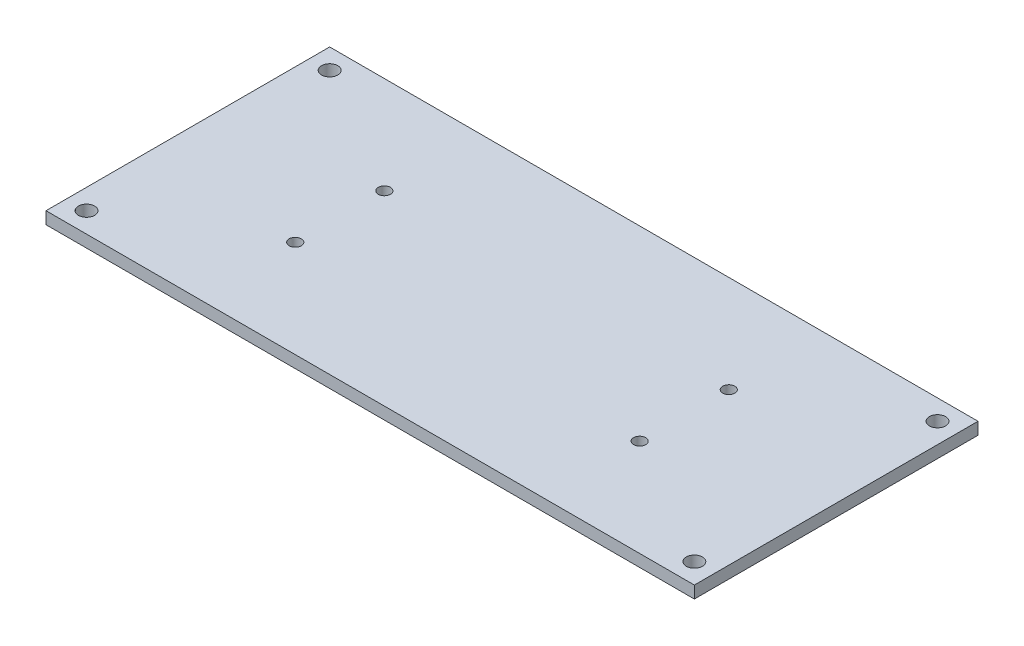
ISO-10303-21;
HEADER;
FILE_DESCRIPTION(('STEP AP214'),'2;1');
FILE_NAME('part.step','',(''),(''),'','','');
FILE_SCHEMA(('AUTOMOTIVE_DESIGN { 1 0 10303 214 1 1 1 1 }'));
ENDSEC;
DATA;
#1=APPLICATION_CONTEXT('core data for automotive mechanical design processes');
#2=APPLICATION_PROTOCOL_DEFINITION('international standard','automotive_design',2000,#1);
#3=PRODUCT_CONTEXT('',#1,'mechanical');
#4=PRODUCT('Part','Part','',(#3));
#5=PRODUCT_RELATED_PRODUCT_CATEGORY('part','',(#4));
#6=PRODUCT_DEFINITION_FORMATION('','',#4);
#7=PRODUCT_DEFINITION_CONTEXT('part definition',#1,'design');
#8=PRODUCT_DEFINITION('design','',#6,#7);
#9=PRODUCT_DEFINITION_SHAPE('','',#8);
#10=(LENGTH_UNIT() NAMED_UNIT(*) SI_UNIT(.MILLI.,.METRE.));
#11=(NAMED_UNIT(*) PLANE_ANGLE_UNIT() SI_UNIT($,.RADIAN.));
#12=(NAMED_UNIT(*) SI_UNIT($,.STERADIAN.) SOLID_ANGLE_UNIT());
#13=UNCERTAINTY_MEASURE_WITH_UNIT(LENGTH_MEASURE(1.E-05),#10,'distance_accuracy_value','');
#14=(GEOMETRIC_REPRESENTATION_CONTEXT(3) GLOBAL_UNCERTAINTY_ASSIGNED_CONTEXT((#13)) GLOBAL_UNIT_ASSIGNED_CONTEXT((#10,
#11,#12)) REPRESENTATION_CONTEXT('',''));
#15=CARTESIAN_POINT('',(0.,0.,0.));
#16=DIRECTION('',(0.,0.,1.));
#17=DIRECTION('',(1.,0.,0.));
#18=AXIS2_PLACEMENT_3D('',#15,#16,#17);
#19=CARTESIAN_POINT('',(80.,3.,-35.));
#20=DIRECTION('',(-1.,0.,0.));
#21=DIRECTION('',(0.,0.,1.));
#22=AXIS2_PLACEMENT_3D('',#19,#20,#21);
#23=PLANE('',#22);
#24=DIRECTION('',(0.,0.,-1.));
#25=VECTOR('',#24,1.);
#26=CARTESIAN_POINT('',(80.,0.,-35.));
#27=LINE('',#26,#25);
#28=CARTESIAN_POINT('',(80.,0.,35.));
#29=VERTEX_POINT('',#28);
#30=CARTESIAN_POINT('',(80.,0.,-35.));
#31=VERTEX_POINT('',#30);
#32=EDGE_CURVE('E101',#29,#31,#27,.T.);
#33=ORIENTED_EDGE('',*,*,#32,.T.);
#34=DIRECTION('',(0.,-1.,0.));
#35=VECTOR('',#34,1.);
#36=CARTESIAN_POINT('',(80.,3.,-35.));
#37=LINE('',#36,#35);
#38=CARTESIAN_POINT('',(80.,3.,-35.));
#39=VERTEX_POINT('',#38);
#40=EDGE_CURVE('E11',#39,#31,#37,.T.);
#41=ORIENTED_EDGE('',*,*,#40,.F.);
#42=DIRECTION('',(0.,0.,-1.));
#43=VECTOR('',#42,1.);
#44=CARTESIAN_POINT('',(80.,3.,-35.));
#45=LINE('',#44,#43);
#46=CARTESIAN_POINT('',(80.,3.,35.));
#47=VERTEX_POINT('',#46);
#48=EDGE_CURVE('E88',#47,#39,#45,.T.);
#49=ORIENTED_EDGE('',*,*,#48,.F.);
#50=DIRECTION('',(0.,-1.,0.));
#51=VECTOR('',#50,1.);
#52=CARTESIAN_POINT('',(80.,3.,35.));
#53=LINE('',#52,#51);
#54=EDGE_CURVE('E97',#47,#29,#53,.T.);
#55=ORIENTED_EDGE('',*,*,#54,.T.);
#56=EDGE_LOOP('',(#33,#41,#49,#55));
#57=FACE_BOUND('',#56,.T.);
#58=ADVANCED_FACE('F35',(#57),#23,.F.);
#59=CARTESIAN_POINT('',(-80.,3.,-35.));
#60=DIRECTION('',(0.,0.,1.));
#61=DIRECTION('',(1.,0.,0.));
#62=AXIS2_PLACEMENT_3D('',#59,#60,#61);
#63=PLANE('',#62);
#64=DIRECTION('',(-1.,0.,0.));
#65=VECTOR('',#64,1.);
#66=CARTESIAN_POINT('',(-80.,0.,-35.));
#67=LINE('',#66,#65);
#68=CARTESIAN_POINT('',(-80.,0.,-35.));
#69=VERTEX_POINT('',#68);
#70=EDGE_CURVE('E92',#31,#69,#67,.T.);
#71=ORIENTED_EDGE('',*,*,#70,.T.);
#72=DIRECTION('',(0.,-1.,0.));
#73=VECTOR('',#72,1.);
#74=CARTESIAN_POINT('',(-80.,3.,-35.));
#75=LINE('',#74,#73);
#76=CARTESIAN_POINT('',(-80.,3.,-35.));
#77=VERTEX_POINT('',#76);
#78=EDGE_CURVE('E44',#77,#69,#75,.T.);
#79=ORIENTED_EDGE('',*,*,#78,.F.);
#80=DIRECTION('',(-1.,0.,0.));
#81=VECTOR('',#80,1.);
#82=CARTESIAN_POINT('',(-80.,3.,-35.));
#83=LINE('',#82,#81);
#84=EDGE_CURVE('E83',#39,#77,#83,.T.);
#85=ORIENTED_EDGE('',*,*,#84,.F.);
#86=ORIENTED_EDGE('',*,*,#40,.T.);
#87=EDGE_LOOP('',(#71,#79,#85,#86));
#88=FACE_BOUND('',#87,.T.);
#89=ADVANCED_FACE('F91',(#88),#63,.F.);
#90=CARTESIAN_POINT('',(-80.,3.,-35.));
#91=DIRECTION('',(1.,0.,0.));
#92=DIRECTION('',(0.,0.,-1.));
#93=AXIS2_PLACEMENT_3D('',#90,#91,#92);
#94=PLANE('',#93);
#95=DIRECTION('',(0.,0.,1.));
#96=VECTOR('',#95,1.);
#97=CARTESIAN_POINT('',(-80.,0.,-35.));
#98=LINE('',#97,#96);
#99=CARTESIAN_POINT('',(-80.,0.,35.));
#100=VERTEX_POINT('',#99);
#101=EDGE_CURVE('E70',#69,#100,#98,.T.);
#102=ORIENTED_EDGE('',*,*,#101,.T.);
#103=DIRECTION('',(0.,-1.,0.));
#104=VECTOR('',#103,1.);
#105=CARTESIAN_POINT('',(-80.,3.,35.));
#106=LINE('',#105,#104);
#107=CARTESIAN_POINT('',(-80.,3.,35.));
#108=VERTEX_POINT('',#107);
#109=EDGE_CURVE('E93',#108,#100,#106,.T.);
#110=ORIENTED_EDGE('',*,*,#109,.F.);
#111=DIRECTION('',(0.,0.,1.));
#112=VECTOR('',#111,1.);
#113=CARTESIAN_POINT('',(-80.,3.,-35.));
#114=LINE('',#113,#112);
#115=EDGE_CURVE('E86',#77,#108,#114,.T.);
#116=ORIENTED_EDGE('',*,*,#115,.F.);
#117=ORIENTED_EDGE('',*,*,#78,.T.);
#118=EDGE_LOOP('',(#102,#110,#116,#117));
#119=FACE_BOUND('',#118,.T.);
#120=ADVANCED_FACE('F95',(#119),#94,.F.);
#121=CARTESIAN_POINT('',(-80.,3.,35.));
#122=DIRECTION('',(0.,0.,-1.));
#123=DIRECTION('',(-1.,0.,0.));
#124=AXIS2_PLACEMENT_3D('',#121,#122,#123);
#125=PLANE('',#124);
#126=DIRECTION('',(1.,0.,0.));
#127=VECTOR('',#126,1.);
#128=CARTESIAN_POINT('',(-80.,0.,35.));
#129=LINE('',#128,#127);
#130=EDGE_CURVE('E76',#100,#29,#129,.T.);
#131=ORIENTED_EDGE('',*,*,#130,.T.);
#132=ORIENTED_EDGE('',*,*,#54,.F.);
#133=DIRECTION('',(1.,0.,0.));
#134=VECTOR('',#133,1.);
#135=CARTESIAN_POINT('',(-80.,3.,35.));
#136=LINE('',#135,#134);
#137=EDGE_CURVE('E53',#108,#47,#136,.T.);
#138=ORIENTED_EDGE('',*,*,#137,.F.);
#139=ORIENTED_EDGE('',*,*,#109,.T.);
#140=EDGE_LOOP('',(#131,#132,#138,#139));
#141=FACE_BOUND('',#140,.T.);
#142=ADVANCED_FACE('F161',(#141),#125,.F.);
#143=CARTESIAN_POINT('',(0.,3.,0.));
#144=DIRECTION('',(0.,1.,0.));
#145=DIRECTION('',(0.,0.,1.));
#146=AXIS2_PLACEMENT_3D('',#143,#144,#145);
#147=PLANE('',#146);
#148=CARTESIAN_POINT('',(-42.5,3.,11.));
#149=DIRECTION('',(0.,1.,0.));
#150=DIRECTION('',(0.,0.,1.));
#151=AXIS2_PLACEMENT_3D('',#148,#149,#150);
#152=CIRCLE('',#151,1.5);
#153=CARTESIAN_POINT('',(-42.5,3.,12.5));
#154=VERTEX_POINT('',#153);
#155=EDGE_CURVE('E131',#154,#154,#152,.T.);
#156=ORIENTED_EDGE('',*,*,#155,.F.);
#157=EDGE_LOOP('',(#156));
#158=FACE_BOUND('',#157,.T.);
#159=CARTESIAN_POINT('',(42.5,3.,11.));
#160=DIRECTION('',(0.,1.,0.));
#161=DIRECTION('',(0.,0.,1.));
#162=AXIS2_PLACEMENT_3D('',#159,#160,#161);
#163=CIRCLE('',#162,1.5);
#164=CARTESIAN_POINT('',(42.5,3.,12.5));
#165=VERTEX_POINT('',#164);
#166=EDGE_CURVE('E280',#165,#165,#163,.T.);
#167=ORIENTED_EDGE('',*,*,#166,.F.);
#168=EDGE_LOOP('',(#167));
#169=FACE_BOUND('',#168,.T.);
#170=CARTESIAN_POINT('',(42.5,3.,-11.));
#171=DIRECTION('',(0.,1.,0.));
#172=DIRECTION('',(0.,0.,1.));
#173=AXIS2_PLACEMENT_3D('',#170,#171,#172);
#174=CIRCLE('',#173,1.5);
#175=CARTESIAN_POINT('',(42.5,3.,-9.49999999999999));
#176=VERTEX_POINT('',#175);
#177=EDGE_CURVE('E144',#176,#176,#174,.T.);
#178=ORIENTED_EDGE('',*,*,#177,.F.);
#179=EDGE_LOOP('',(#178));
#180=FACE_BOUND('',#179,.T.);
#181=CARTESIAN_POINT('',(-42.5,3.,-11.));
#182=DIRECTION('',(0.,1.,0.));
#183=DIRECTION('',(0.,0.,1.));
#184=AXIS2_PLACEMENT_3D('',#181,#182,#183);
#185=CIRCLE('',#184,1.5);
#186=CARTESIAN_POINT('',(-42.5,3.,-9.49999999999999));
#187=VERTEX_POINT('',#186);
#188=EDGE_CURVE('E127',#187,#187,#185,.T.);
#189=ORIENTED_EDGE('',*,*,#188,.F.);
#190=EDGE_LOOP('',(#189));
#191=FACE_BOUND('',#190,.T.);
#192=CARTESIAN_POINT('',(-75.,3.,30.));
#193=DIRECTION('',(0.,1.,0.));
#194=DIRECTION('',(0.,0.,1.));
#195=AXIS2_PLACEMENT_3D('',#192,#193,#194);
#196=CIRCLE('',#195,2.);
#197=CARTESIAN_POINT('',(-75.,3.,32.));
#198=VERTEX_POINT('',#197);
#199=EDGE_CURVE('E117',#198,#198,#196,.T.);
#200=ORIENTED_EDGE('',*,*,#199,.F.);
#201=EDGE_LOOP('',(#200));
#202=FACE_BOUND('',#201,.T.);
#203=CARTESIAN_POINT('',(75.,3.,30.));
#204=DIRECTION('',(0.,1.,0.));
#205=DIRECTION('',(0.,0.,1.));
#206=AXIS2_PLACEMENT_3D('',#203,#204,#205);
#207=CIRCLE('',#206,2.);
#208=CARTESIAN_POINT('',(75.,3.,32.));
#209=VERTEX_POINT('',#208);
#210=EDGE_CURVE('E148',#209,#209,#207,.T.);
#211=ORIENTED_EDGE('',*,*,#210,.F.);
#212=EDGE_LOOP('',(#211));
#213=FACE_BOUND('',#212,.T.);
#214=CARTESIAN_POINT('',(75.,3.,-30.));
#215=DIRECTION('',(0.,1.,0.));
#216=DIRECTION('',(0.,0.,1.));
#217=AXIS2_PLACEMENT_3D('',#214,#215,#216);
#218=CIRCLE('',#217,2.);
#219=CARTESIAN_POINT('',(75.,3.,-28.));
#220=VERTEX_POINT('',#219);
#221=EDGE_CURVE('E126',#220,#220,#218,.T.);
#222=ORIENTED_EDGE('',*,*,#221,.F.);
#223=EDGE_LOOP('',(#222));
#224=FACE_BOUND('',#223,.T.);
#225=CARTESIAN_POINT('',(-75.,3.,-30.));
#226=DIRECTION('',(0.,1.,0.));
#227=DIRECTION('',(0.,0.,1.));
#228=AXIS2_PLACEMENT_3D('',#225,#226,#227);
#229=CIRCLE('',#228,2.);
#230=CARTESIAN_POINT('',(-75.,3.,-28.));
#231=VERTEX_POINT('',#230);
#232=EDGE_CURVE('E112',#231,#231,#229,.T.);
#233=ORIENTED_EDGE('',*,*,#232,.F.);
#234=EDGE_LOOP('',(#233));
#235=FACE_BOUND('',#234,.T.);
#236=ORIENTED_EDGE('',*,*,#48,.T.);
#237=ORIENTED_EDGE('',*,*,#84,.T.);
#238=ORIENTED_EDGE('',*,*,#115,.T.);
#239=ORIENTED_EDGE('',*,*,#137,.T.);
#240=EDGE_LOOP('',(#236,#237,#238,#239));
#241=FACE_BOUND('',#240,.T.);
#242=ADVANCED_FACE('F84',(#158,#169,#180,#191,#202,#213,#224,#235,#241),#147,.T.);
#243=CARTESIAN_POINT('',(0.,0.,0.));
#244=DIRECTION('',(0.,1.,0.));
#245=DIRECTION('',(0.,0.,1.));
#246=AXIS2_PLACEMENT_3D('',#243,#244,#245);
#247=PLANE('',#246);
#248=CARTESIAN_POINT('',(-42.5,0.,11.));
#249=DIRECTION('',(0.,1.,0.));
#250=DIRECTION('',(0.,0.,1.));
#251=AXIS2_PLACEMENT_3D('',#248,#249,#250);
#252=CIRCLE('',#251,1.5);
#253=CARTESIAN_POINT('',(-42.5,0.,12.5));
#254=VERTEX_POINT('',#253);
#255=EDGE_CURVE('E38',#254,#254,#252,.T.);
#256=ORIENTED_EDGE('',*,*,#255,.T.);
#257=EDGE_LOOP('',(#256));
#258=FACE_BOUND('',#257,.T.);
#259=CARTESIAN_POINT('',(42.5,0.,11.));
#260=DIRECTION('',(0.,1.,0.));
#261=DIRECTION('',(0.,0.,1.));
#262=AXIS2_PLACEMENT_3D('',#259,#260,#261);
#263=CIRCLE('',#262,1.5);
#264=CARTESIAN_POINT('',(42.5,0.,12.5));
#265=VERTEX_POINT('',#264);
#266=EDGE_CURVE('E130',#265,#265,#263,.T.);
#267=ORIENTED_EDGE('',*,*,#266,.T.);
#268=EDGE_LOOP('',(#267));
#269=FACE_BOUND('',#268,.T.);
#270=CARTESIAN_POINT('',(42.5,0.,-11.));
#271=DIRECTION('',(0.,1.,0.));
#272=DIRECTION('',(0.,0.,1.));
#273=AXIS2_PLACEMENT_3D('',#270,#271,#272);
#274=CIRCLE('',#273,1.5);
#275=CARTESIAN_POINT('',(42.5,0.,-9.49999999999999));
#276=VERTEX_POINT('',#275);
#277=EDGE_CURVE('E128',#276,#276,#274,.T.);
#278=ORIENTED_EDGE('',*,*,#277,.T.);
#279=EDGE_LOOP('',(#278));
#280=FACE_BOUND('',#279,.T.);
#281=CARTESIAN_POINT('',(-42.5,0.,-11.));
#282=DIRECTION('',(0.,1.,0.));
#283=DIRECTION('',(0.,0.,1.));
#284=AXIS2_PLACEMENT_3D('',#281,#282,#283);
#285=CIRCLE('',#284,1.5);
#286=CARTESIAN_POINT('',(-42.5,0.,-9.49999999999999));
#287=VERTEX_POINT('',#286);
#288=EDGE_CURVE('E123',#287,#287,#285,.T.);
#289=ORIENTED_EDGE('',*,*,#288,.T.);
#290=EDGE_LOOP('',(#289));
#291=FACE_BOUND('',#290,.T.);
#292=CARTESIAN_POINT('',(-75.,0.,30.));
#293=DIRECTION('',(0.,1.,0.));
#294=DIRECTION('',(0.,0.,1.));
#295=AXIS2_PLACEMENT_3D('',#292,#293,#294);
#296=CIRCLE('',#295,2.);
#297=CARTESIAN_POINT('',(-75.,0.,32.));
#298=VERTEX_POINT('',#297);
#299=EDGE_CURVE('E120',#298,#298,#296,.T.);
#300=ORIENTED_EDGE('',*,*,#299,.T.);
#301=EDGE_LOOP('',(#300));
#302=FACE_BOUND('',#301,.T.);
#303=CARTESIAN_POINT('',(75.,0.,30.));
#304=DIRECTION('',(0.,1.,0.));
#305=DIRECTION('',(0.,0.,1.));
#306=AXIS2_PLACEMENT_3D('',#303,#304,#305);
#307=CIRCLE('',#306,2.);
#308=CARTESIAN_POINT('',(75.,0.,32.));
#309=VERTEX_POINT('',#308);
#310=EDGE_CURVE('E116',#309,#309,#307,.T.);
#311=ORIENTED_EDGE('',*,*,#310,.T.);
#312=EDGE_LOOP('',(#311));
#313=FACE_BOUND('',#312,.T.);
#314=CARTESIAN_POINT('',(75.,0.,-30.));
#315=DIRECTION('',(0.,1.,0.));
#316=DIRECTION('',(0.,0.,1.));
#317=AXIS2_PLACEMENT_3D('',#314,#315,#316);
#318=CIRCLE('',#317,2.);
#319=CARTESIAN_POINT('',(75.,0.,-28.));
#320=VERTEX_POINT('',#319);
#321=EDGE_CURVE('E113',#320,#320,#318,.T.);
#322=ORIENTED_EDGE('',*,*,#321,.T.);
#323=EDGE_LOOP('',(#322));
#324=FACE_BOUND('',#323,.T.);
#325=CARTESIAN_POINT('',(-75.,0.,-30.));
#326=DIRECTION('',(0.,1.,0.));
#327=DIRECTION('',(0.,0.,1.));
#328=AXIS2_PLACEMENT_3D('',#325,#326,#327);
#329=CIRCLE('',#328,2.);
#330=CARTESIAN_POINT('',(-75.,0.,-28.));
#331=VERTEX_POINT('',#330);
#332=EDGE_CURVE('E104',#331,#331,#329,.T.);
#333=ORIENTED_EDGE('',*,*,#332,.T.);
#334=EDGE_LOOP('',(#333));
#335=FACE_BOUND('',#334,.T.);
#336=ORIENTED_EDGE('',*,*,#32,.F.);
#337=ORIENTED_EDGE('',*,*,#130,.F.);
#338=ORIENTED_EDGE('',*,*,#101,.F.);
#339=ORIENTED_EDGE('',*,*,#70,.F.);
#340=EDGE_LOOP('',(#336,#337,#338,#339));
#341=FACE_BOUND('',#340,.T.);
#342=ADVANCED_FACE('F160',(#258,#269,#280,#291,#302,#313,#324,#335,#341),#247,.F.);
#343=CARTESIAN_POINT('',(-75.,-117.,-30.));
#344=DIRECTION('',(0.,1.,0.));
#345=DIRECTION('',(0.,0.,1.));
#346=AXIS2_PLACEMENT_3D('',#343,#344,#345);
#347=CYLINDRICAL_SURFACE('',#346,2.);
#348=ORIENTED_EDGE('',*,*,#232,.T.);
#349=EDGE_LOOP('',(#348));
#350=FACE_BOUND('',#349,.T.);
#351=ORIENTED_EDGE('',*,*,#332,.F.);
#352=EDGE_LOOP('',(#351));
#353=FACE_BOUND('',#352,.T.);
#354=ADVANCED_FACE('F156',(#350,#353),#347,.F.);
#355=CARTESIAN_POINT('',(75.,-117.,-30.));
#356=DIRECTION('',(0.,1.,0.));
#357=DIRECTION('',(0.,0.,1.));
#358=AXIS2_PLACEMENT_3D('',#355,#356,#357);
#359=CYLINDRICAL_SURFACE('',#358,2.);
#360=ORIENTED_EDGE('',*,*,#221,.T.);
#361=EDGE_LOOP('',(#360));
#362=FACE_BOUND('',#361,.T.);
#363=ORIENTED_EDGE('',*,*,#321,.F.);
#364=EDGE_LOOP('',(#363));
#365=FACE_BOUND('',#364,.T.);
#366=ADVANCED_FACE('F209',(#362,#365),#359,.F.);
#367=CARTESIAN_POINT('',(75.,-117.,30.));
#368=DIRECTION('',(0.,1.,0.));
#369=DIRECTION('',(0.,0.,1.));
#370=AXIS2_PLACEMENT_3D('',#367,#368,#369);
#371=CYLINDRICAL_SURFACE('',#370,2.);
#372=ORIENTED_EDGE('',*,*,#210,.T.);
#373=EDGE_LOOP('',(#372));
#374=FACE_BOUND('',#373,.T.);
#375=ORIENTED_EDGE('',*,*,#310,.F.);
#376=EDGE_LOOP('',(#375));
#377=FACE_BOUND('',#376,.T.);
#378=ADVANCED_FACE('F214',(#374,#377),#371,.F.);
#379=CARTESIAN_POINT('',(-75.,-117.,30.));
#380=DIRECTION('',(0.,1.,0.));
#381=DIRECTION('',(0.,0.,1.));
#382=AXIS2_PLACEMENT_3D('',#379,#380,#381);
#383=CYLINDRICAL_SURFACE('',#382,2.);
#384=ORIENTED_EDGE('',*,*,#199,.T.);
#385=EDGE_LOOP('',(#384));
#386=FACE_BOUND('',#385,.T.);
#387=ORIENTED_EDGE('',*,*,#299,.F.);
#388=EDGE_LOOP('',(#387));
#389=FACE_BOUND('',#388,.T.);
#390=ADVANCED_FACE('F222',(#386,#389),#383,.F.);
#391=CARTESIAN_POINT('',(-42.5,-7.,-11.));
#392=DIRECTION('',(0.,1.,0.));
#393=DIRECTION('',(0.,0.,1.));
#394=AXIS2_PLACEMENT_3D('',#391,#392,#393);
#395=CYLINDRICAL_SURFACE('',#394,1.5);
#396=ORIENTED_EDGE('',*,*,#188,.T.);
#397=EDGE_LOOP('',(#396));
#398=FACE_BOUND('',#397,.T.);
#399=ORIENTED_EDGE('',*,*,#288,.F.);
#400=EDGE_LOOP('',(#399));
#401=FACE_BOUND('',#400,.T.);
#402=ADVANCED_FACE('F229',(#398,#401),#395,.F.);
#403=CARTESIAN_POINT('',(42.5,-7.,-11.));
#404=DIRECTION('',(0.,1.,0.));
#405=DIRECTION('',(0.,0.,1.));
#406=AXIS2_PLACEMENT_3D('',#403,#404,#405);
#407=CYLINDRICAL_SURFACE('',#406,1.5);
#408=ORIENTED_EDGE('',*,*,#177,.T.);
#409=EDGE_LOOP('',(#408));
#410=FACE_BOUND('',#409,.T.);
#411=ORIENTED_EDGE('',*,*,#277,.F.);
#412=EDGE_LOOP('',(#411));
#413=FACE_BOUND('',#412,.T.);
#414=ADVANCED_FACE('F236',(#410,#413),#407,.F.);
#415=CARTESIAN_POINT('',(42.5,-7.,11.));
#416=DIRECTION('',(0.,1.,0.));
#417=DIRECTION('',(0.,0.,1.));
#418=AXIS2_PLACEMENT_3D('',#415,#416,#417);
#419=CYLINDRICAL_SURFACE('',#418,1.5);
#420=ORIENTED_EDGE('',*,*,#166,.T.);
#421=EDGE_LOOP('',(#420));
#422=FACE_BOUND('',#421,.T.);
#423=ORIENTED_EDGE('',*,*,#266,.F.);
#424=EDGE_LOOP('',(#423));
#425=FACE_BOUND('',#424,.T.);
#426=ADVANCED_FACE('F243',(#422,#425),#419,.F.);
#427=CARTESIAN_POINT('',(-42.5,-7.,11.));
#428=DIRECTION('',(0.,1.,0.));
#429=DIRECTION('',(0.,0.,1.));
#430=AXIS2_PLACEMENT_3D('',#427,#428,#429);
#431=CYLINDRICAL_SURFACE('',#430,1.5);
#432=ORIENTED_EDGE('',*,*,#155,.T.);
#433=EDGE_LOOP('',(#432));
#434=FACE_BOUND('',#433,.T.);
#435=ORIENTED_EDGE('',*,*,#255,.F.);
#436=EDGE_LOOP('',(#435));
#437=FACE_BOUND('',#436,.T.);
#438=ADVANCED_FACE('F251',(#434,#437),#431,.F.);
#439=CLOSED_SHELL('',(#58,#89,#120,#142,#242,#342,#354,#366,#378,#390,#402,#414,#426,#438));
#440=MANIFOLD_SOLID_BREP('B2',#439);
#441=ADVANCED_BREP_SHAPE_REPRESENTATION('',(#18,#440),#14);
#442=SHAPE_DEFINITION_REPRESENTATION(#9,#441);
ENDSEC;
END-ISO-10303-21;
